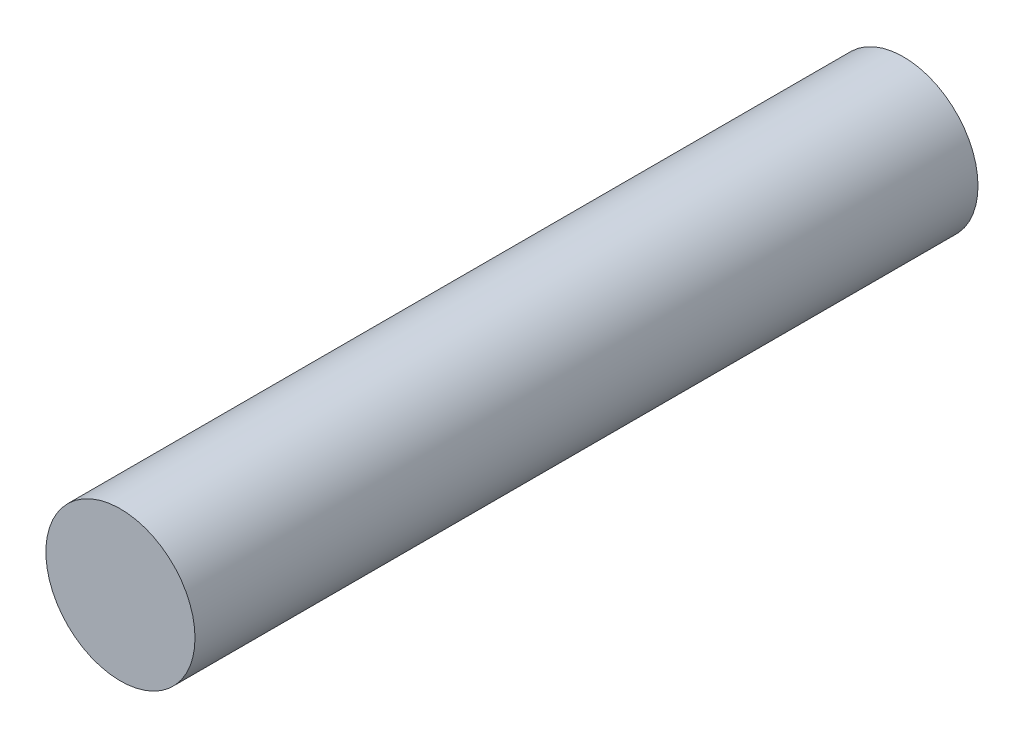
ISO-10303-21;
HEADER;
FILE_DESCRIPTION(('STEP AP214'),'2;1');
FILE_NAME('part.step','',(''),(''),'','','');
FILE_SCHEMA(('AUTOMOTIVE_DESIGN { 1 0 10303 214 1 1 1 1 }'));
ENDSEC;
DATA;
#1=APPLICATION_CONTEXT('core data for automotive mechanical design processes');
#2=APPLICATION_PROTOCOL_DEFINITION('international standard','automotive_design',2000,#1);
#3=PRODUCT_CONTEXT('',#1,'mechanical');
#4=PRODUCT('Part','Part','',(#3));
#5=PRODUCT_RELATED_PRODUCT_CATEGORY('part','',(#4));
#6=PRODUCT_DEFINITION_FORMATION('','',#4);
#7=PRODUCT_DEFINITION_CONTEXT('part definition',#1,'design');
#8=PRODUCT_DEFINITION('design','',#6,#7);
#9=PRODUCT_DEFINITION_SHAPE('','',#8);
#10=(LENGTH_UNIT() NAMED_UNIT(*) SI_UNIT(.MILLI.,.METRE.));
#11=(NAMED_UNIT(*) PLANE_ANGLE_UNIT() SI_UNIT($,.RADIAN.));
#12=(NAMED_UNIT(*) SI_UNIT($,.STERADIAN.) SOLID_ANGLE_UNIT());
#13=UNCERTAINTY_MEASURE_WITH_UNIT(LENGTH_MEASURE(1.E-05),#10,'distance_accuracy_value','');
#14=(GEOMETRIC_REPRESENTATION_CONTEXT(3) GLOBAL_UNCERTAINTY_ASSIGNED_CONTEXT((#13)) GLOBAL_UNIT_ASSIGNED_CONTEXT((#10,
#11,#12)) REPRESENTATION_CONTEXT('',''));
#15=CARTESIAN_POINT('',(0.,0.,0.));
#16=DIRECTION('',(0.,0.,1.));
#17=DIRECTION('',(1.,0.,0.));
#18=AXIS2_PLACEMENT_3D('',#15,#16,#17);
#19=CARTESIAN_POINT('',(0.,0.,0.));
#20=DIRECTION('',(0.,0.,1.));
#21=DIRECTION('',(1.,0.,0.));
#22=AXIS2_PLACEMENT_3D('',#19,#20,#21);
#23=PLANE('',#22);
#24=CARTESIAN_POINT('',(0.,0.,0.));
#25=DIRECTION('',(0.,0.,1.));
#26=DIRECTION('',(1.,0.,0.));
#27=AXIS2_PLACEMENT_3D('',#24,#25,#26);
#28=CIRCLE('',#27,2.);
#29=CARTESIAN_POINT('',(2.,0.,0.));
#30=VERTEX_POINT('',#29);
#31=EDGE_CURVE('E10',#30,#30,#28,.T.);
#32=ORIENTED_EDGE('',*,*,#31,.F.);
#33=EDGE_LOOP('',(#32));
#34=FACE_BOUND('',#33,.T.);
#35=ADVANCED_FACE('F35',(#34),#23,.F.);
#36=CARTESIAN_POINT('',(0.,0.,-7.00000000000001));
#37=DIRECTION('',(0.,0.,1.));
#38=DIRECTION('',(1.,0.,0.));
#39=AXIS2_PLACEMENT_3D('',#36,#37,#38);
#40=CYLINDRICAL_SURFACE('',#39,2.);
#41=CARTESIAN_POINT('',(0.,0.,21.));
#42=DIRECTION('',(0.,0.,1.));
#43=DIRECTION('',(1.,0.,0.));
#44=AXIS2_PLACEMENT_3D('',#41,#42,#43);
#45=CIRCLE('',#44,2.);
#46=CARTESIAN_POINT('',(2.,0.,21.));
#47=VERTEX_POINT('',#46);
#48=EDGE_CURVE('E41',#47,#47,#45,.T.);
#49=ORIENTED_EDGE('',*,*,#48,.F.);
#50=EDGE_LOOP('',(#49));
#51=FACE_BOUND('',#50,.T.);
#52=ORIENTED_EDGE('',*,*,#31,.T.);
#53=EDGE_LOOP('',(#52));
#54=FACE_BOUND('',#53,.T.);
#55=ADVANCED_FACE('F49',(#51,#54),#40,.T.);
#56=CARTESIAN_POINT('',(0.,0.,21.));
#57=DIRECTION('',(0.,0.,1.));
#58=DIRECTION('',(1.,0.,0.));
#59=AXIS2_PLACEMENT_3D('',#56,#57,#58);
#60=PLANE('',#59);
#61=ORIENTED_EDGE('',*,*,#48,.T.);
#62=EDGE_LOOP('',(#61));
#63=FACE_BOUND('',#62,.T.);
#64=ADVANCED_FACE('F47',(#63),#60,.T.);
#65=CLOSED_SHELL('',(#35,#55,#64));
#66=MANIFOLD_SOLID_BREP('B2',#65);
#67=ADVANCED_BREP_SHAPE_REPRESENTATION('',(#18,#66),#14);
#68=SHAPE_DEFINITION_REPRESENTATION(#9,#67);
ENDSEC;
END-ISO-10303-21;
